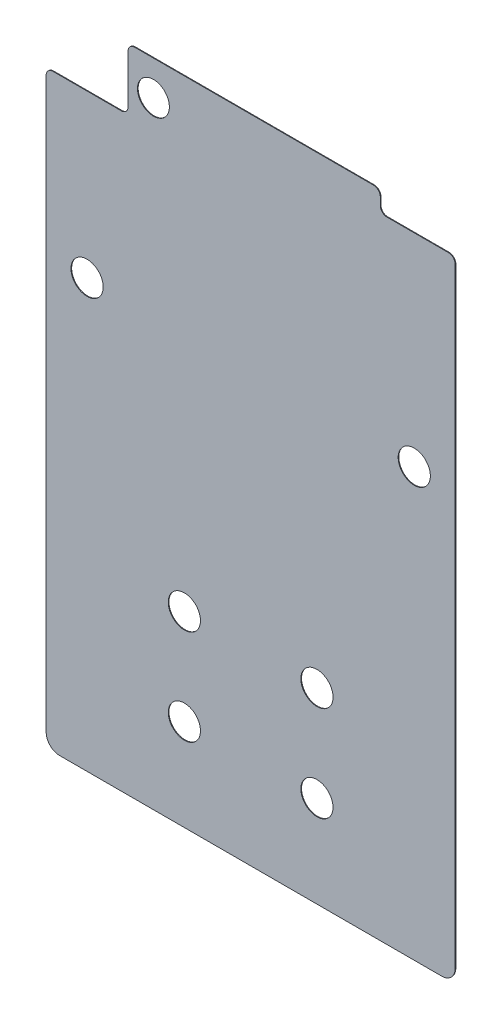
ISO-10303-21;
HEADER;
FILE_DESCRIPTION(('STEP AP214'),'2;1');
FILE_NAME('part.step','',(''),(''),'','','');
FILE_SCHEMA(('AUTOMOTIVE_DESIGN { 1 0 10303 214 1 1 1 1 }'));
ENDSEC;
DATA;
#1=APPLICATION_CONTEXT('core data for automotive mechanical design processes');
#2=APPLICATION_PROTOCOL_DEFINITION('international standard','automotive_design',2000,#1);
#3=PRODUCT_CONTEXT('',#1,'mechanical');
#4=PRODUCT('Part','Part','',(#3));
#5=PRODUCT_RELATED_PRODUCT_CATEGORY('part','',(#4));
#6=PRODUCT_DEFINITION_FORMATION('','',#4);
#7=PRODUCT_DEFINITION_CONTEXT('part definition',#1,'design');
#8=PRODUCT_DEFINITION('design','',#6,#7);
#9=PRODUCT_DEFINITION_SHAPE('','',#8);
#10=(LENGTH_UNIT() NAMED_UNIT(*) SI_UNIT(.MILLI.,.METRE.));
#11=(NAMED_UNIT(*) PLANE_ANGLE_UNIT() SI_UNIT($,.RADIAN.));
#12=(NAMED_UNIT(*) SI_UNIT($,.STERADIAN.) SOLID_ANGLE_UNIT());
#13=UNCERTAINTY_MEASURE_WITH_UNIT(LENGTH_MEASURE(1.E-05),#10,'distance_accuracy_value','');
#14=(GEOMETRIC_REPRESENTATION_CONTEXT(3) GLOBAL_UNCERTAINTY_ASSIGNED_CONTEXT((#13)) GLOBAL_UNIT_ASSIGNED_CONTEXT((#10,
#11,#12)) REPRESENTATION_CONTEXT('',''));
#15=CARTESIAN_POINT('',(0.,0.,0.));
#16=DIRECTION('',(0.,0.,1.));
#17=DIRECTION('',(1.,0.,0.));
#18=AXIS2_PLACEMENT_3D('',#15,#16,#17);
#19=CARTESIAN_POINT('',(-15.24,24.257,-0.05));
#20=DIRECTION('',(-1.,0.,0.));
#21=DIRECTION('',(0.,0.,1.));
#22=AXIS2_PLACEMENT_3D('',#19,#20,#21);
#23=PLANE('',#22);
#24=DIRECTION('',(0.,-1.,0.));
#25=VECTOR('',#24,1.);
#26=CARTESIAN_POINT('',(-15.24,24.257,0.));
#27=LINE('',#26,#25);
#28=CARTESIAN_POINT('',(-15.24,19.155745374,0.));
#29=VERTEX_POINT('',#28);
#30=CARTESIAN_POINT('',(-15.24,-23.257,0.));
#31=VERTEX_POINT('',#30);
#32=EDGE_CURVE('E137',#29,#31,#27,.T.);
#33=ORIENTED_EDGE('',*,*,#32,.F.);
#34=DIRECTION('',(0.,0.,1.));
#35=VECTOR('',#34,1.);
#36=CARTESIAN_POINT('',(-15.24,19.155745374,-0.05));
#37=LINE('',#36,#35);
#38=CARTESIAN_POINT('',(-15.24,19.155745374,-0.05));
#39=VERTEX_POINT('',#38);
#40=EDGE_CURVE('E195',#29,#39,#37,.F.);
#41=ORIENTED_EDGE('',*,*,#40,.T.);
#42=DIRECTION('',(0.,-1.,0.));
#43=VECTOR('',#42,1.);
#44=CARTESIAN_POINT('',(-15.24,24.257,-0.05));
#45=LINE('',#44,#43);
#46=CARTESIAN_POINT('',(-15.24,-23.257,-0.05));
#47=VERTEX_POINT('',#46);
#48=EDGE_CURVE('E158',#39,#47,#45,.T.);
#49=ORIENTED_EDGE('',*,*,#48,.T.);
#50=DIRECTION('',(0.,0.,1.));
#51=VECTOR('',#50,1.);
#52=CARTESIAN_POINT('',(-15.24,-23.257,-0.05));
#53=LINE('',#52,#51);
#54=EDGE_CURVE('E171',#47,#31,#53,.T.);
#55=ORIENTED_EDGE('',*,*,#54,.T.);
#56=EDGE_LOOP('',(#33,#41,#49,#55));
#57=FACE_BOUND('',#56,.T.);
#58=ADVANCED_FACE('F17',(#57),#23,.T.);
#59=CARTESIAN_POINT('',(15.24,24.257,-0.05));
#60=DIRECTION('',(0.,1.,0.));
#61=DIRECTION('',(-1.,0.,0.));
#62=AXIS2_PLACEMENT_3D('',#59,#60,#61);
#63=PLANE('',#62);
#64=DIRECTION('',(-1.,0.,0.));
#65=VECTOR('',#64,1.);
#66=CARTESIAN_POINT('',(15.24,24.257,0.));
#67=LINE('',#66,#65);
#68=CARTESIAN_POINT('',(9.16,24.257,0.));
#69=VERTEX_POINT('',#68);
#70=CARTESIAN_POINT('',(-8.63662,24.257,0.));
#71=VERTEX_POINT('',#70);
#72=EDGE_CURVE('E291',#69,#71,#67,.T.);
#73=ORIENTED_EDGE('',*,*,#72,.F.);
#74=DIRECTION('',(0.,0.,1.));
#75=VECTOR('',#74,1.);
#76=CARTESIAN_POINT('',(9.16,24.257,-0.05));
#77=LINE('',#76,#75);
#78=CARTESIAN_POINT('',(9.16,24.257,-0.05));
#79=VERTEX_POINT('',#78);
#80=EDGE_CURVE('E220',#69,#79,#77,.F.);
#81=ORIENTED_EDGE('',*,*,#80,.T.);
#82=DIRECTION('',(-1.,0.,0.));
#83=VECTOR('',#82,1.);
#84=CARTESIAN_POINT('',(15.24,24.257,-0.05));
#85=LINE('',#84,#83);
#86=CARTESIAN_POINT('',(-8.63662,24.257,-0.05));
#87=VERTEX_POINT('',#86);
#88=EDGE_CURVE('E161',#79,#87,#85,.T.);
#89=ORIENTED_EDGE('',*,*,#88,.T.);
#90=DIRECTION('',(0.,0.,1.));
#91=VECTOR('',#90,1.);
#92=CARTESIAN_POINT('',(-8.63662,24.257,-0.05));
#93=LINE('',#92,#91);
#94=EDGE_CURVE('E173',#87,#71,#93,.T.);
#95=ORIENTED_EDGE('',*,*,#94,.T.);
#96=EDGE_LOOP('',(#73,#81,#89,#95));
#97=FACE_BOUND('',#96,.T.);
#98=ADVANCED_FACE('F303',(#97),#63,.T.);
#99=CARTESIAN_POINT('',(-7.6962,-25.8572,-0.05));
#100=DIRECTION('',(0.,0.,1.));
#101=DIRECTION('',(1.,0.,0.));
#102=AXIS2_PLACEMENT_3D('',#99,#100,#101);
#103=PLANE('',#102);
#104=CARTESIAN_POINT('',(12.192,7.601,-0.05));
#105=DIRECTION('',(0.,0.,1.));
#106=DIRECTION('',(1.,0.,0.));
#107=AXIS2_PLACEMENT_3D('',#104,#105,#106);
#108=CIRCLE('',#107,1.2);
#109=CARTESIAN_POINT('',(13.392,7.601,-0.05));
#110=VERTEX_POINT('',#109);
#111=EDGE_CURVE('E256',#110,#110,#108,.F.);
#112=ORIENTED_EDGE('',*,*,#111,.F.);
#113=EDGE_LOOP('',(#112));
#114=FACE_BOUND('',#113,.T.);
#115=CARTESIAN_POINT('',(4.9403,-10.306,-0.05));
#116=DIRECTION('',(0.,0.,1.));
#117=DIRECTION('',(1.,0.,0.));
#118=AXIS2_PLACEMENT_3D('',#115,#116,#117);
#119=CIRCLE('',#118,1.2);
#120=CARTESIAN_POINT('',(6.1403,-10.306,-0.05));
#121=VERTEX_POINT('',#120);
#122=EDGE_CURVE('E266',#121,#121,#119,.F.);
#123=ORIENTED_EDGE('',*,*,#122,.F.);
#124=EDGE_LOOP('',(#123));
#125=FACE_BOUND('',#124,.T.);
#126=CARTESIAN_POINT('',(-4.9403,-10.306,-0.05));
#127=DIRECTION('',(0.,0.,1.));
#128=DIRECTION('',(1.,0.,0.));
#129=AXIS2_PLACEMENT_3D('',#126,#127,#128);
#130=CIRCLE('',#129,1.2);
#131=CARTESIAN_POINT('',(-3.7403,-10.306,-0.05));
#132=VERTEX_POINT('',#131);
#133=EDGE_CURVE('E272',#132,#132,#130,.F.);
#134=ORIENTED_EDGE('',*,*,#133,.F.);
#135=EDGE_LOOP('',(#134));
#136=FACE_BOUND('',#135,.T.);
#137=CARTESIAN_POINT('',(-4.9403,-17.418,-0.05));
#138=DIRECTION('',(0.,0.,1.));
#139=DIRECTION('',(1.,0.,0.));
#140=AXIS2_PLACEMENT_3D('',#137,#138,#139);
#141=CIRCLE('',#140,1.2);
#142=CARTESIAN_POINT('',(-3.7403,-17.418,-0.05));
#143=VERTEX_POINT('',#142);
#144=EDGE_CURVE('E278',#143,#143,#141,.F.);
#145=ORIENTED_EDGE('',*,*,#144,.F.);
#146=EDGE_LOOP('',(#145));
#147=FACE_BOUND('',#146,.T.);
#148=CARTESIAN_POINT('',(4.9403,-17.418,-0.05));
#149=DIRECTION('',(0.,0.,1.));
#150=DIRECTION('',(1.,0.,0.));
#151=AXIS2_PLACEMENT_3D('',#148,#149,#150);
#152=CIRCLE('',#151,1.2);
#153=CARTESIAN_POINT('',(6.1403,-17.418,-0.05));
#154=VERTEX_POINT('',#153);
#155=EDGE_CURVE('E245',#154,#154,#152,.F.);
#156=ORIENTED_EDGE('',*,*,#155,.F.);
#157=EDGE_LOOP('',(#156));
#158=FACE_BOUND('',#157,.T.);
#159=CARTESIAN_POINT('',(-12.192,7.601,-0.05));
#160=DIRECTION('',(0.,0.,1.));
#161=DIRECTION('',(1.,0.,0.));
#162=AXIS2_PLACEMENT_3D('',#159,#160,#161);
#163=CIRCLE('',#162,1.2);
#164=CARTESIAN_POINT('',(-10.992,7.601,-0.05));
#165=VERTEX_POINT('',#164);
#166=EDGE_CURVE('E255',#165,#165,#163,.F.);
#167=ORIENTED_EDGE('',*,*,#166,.F.);
#168=EDGE_LOOP('',(#167));
#169=FACE_BOUND('',#168,.T.);
#170=CARTESIAN_POINT('',(-7.24662,21.693243634,-0.05));
#171=DIRECTION('',(0.,0.,1.));
#172=DIRECTION('',(1.,0.,0.));
#173=AXIS2_PLACEMENT_3D('',#170,#171,#172);
#174=CIRCLE('',#173,1.18749826);
#175=CARTESIAN_POINT('',(-6.05912174,21.693243634,-0.05));
#176=VERTEX_POINT('',#175);
#177=EDGE_CURVE('E250',#176,#176,#174,.F.);
#178=ORIENTED_EDGE('',*,*,#177,.F.);
#179=EDGE_LOOP('',(#178));
#180=FACE_BOUND('',#179,.T.);
#181=DIRECTION('',(-1.,0.,0.));
#182=VECTOR('',#181,1.);
#183=CARTESIAN_POINT('',(15.24,22.695,-0.05));
#184=LINE('',#183,#182);
#185=CARTESIAN_POINT('',(14.74,22.695,-0.05));
#186=VERTEX_POINT('',#185);
#187=CARTESIAN_POINT('',(10.16,22.695,-0.05));
#188=VERTEX_POINT('',#187);
#189=EDGE_CURVE('E237',#186,#188,#184,.T.);
#190=ORIENTED_EDGE('',*,*,#189,.F.);
#191=CARTESIAN_POINT('',(14.74,22.195,-0.05));
#192=DIRECTION('',(0.,0.,1.));
#193=DIRECTION('',(1.,0.,0.));
#194=AXIS2_PLACEMENT_3D('',#191,#192,#193);
#195=CIRCLE('',#194,0.5);
#196=CARTESIAN_POINT('',(15.24,22.195,-0.05));
#197=VERTEX_POINT('',#196);
#198=EDGE_CURVE('E214',#186,#197,#195,.F.);
#199=ORIENTED_EDGE('',*,*,#198,.T.);
#200=DIRECTION('',(0.,1.,0.));
#201=VECTOR('',#200,1.);
#202=CARTESIAN_POINT('',(15.24,-24.257,-0.05));
#203=LINE('',#202,#201);
#204=CARTESIAN_POINT('',(15.24,-23.257,-0.05));
#205=VERTEX_POINT('',#204);
#206=EDGE_CURVE('E286',#205,#197,#203,.T.);
#207=ORIENTED_EDGE('',*,*,#206,.F.);
#208=CARTESIAN_POINT('',(14.24,-23.257,-0.05));
#209=DIRECTION('',(0.,0.,1.));
#210=DIRECTION('',(1.,0.,0.));
#211=AXIS2_PLACEMENT_3D('',#208,#209,#210);
#212=CIRCLE('',#211,1.);
#213=CARTESIAN_POINT('',(14.24,-24.257,-0.05));
#214=VERTEX_POINT('',#213);
#215=EDGE_CURVE('E169',#205,#214,#212,.F.);
#216=ORIENTED_EDGE('',*,*,#215,.T.);
#217=DIRECTION('',(1.,0.,0.));
#218=VECTOR('',#217,1.);
#219=CARTESIAN_POINT('',(7.6962,-24.257,-0.05));
#220=LINE('',#219,#218);
#221=CARTESIAN_POINT('',(-14.24,-24.257,-0.05));
#222=VERTEX_POINT('',#221);
#223=EDGE_CURVE('E152',#222,#214,#220,.T.);
#224=ORIENTED_EDGE('',*,*,#223,.F.);
#225=CARTESIAN_POINT('',(-14.24,-23.257,-0.05));
#226=DIRECTION('',(0.,0.,1.));
#227=DIRECTION('',(1.,0.,0.));
#228=AXIS2_PLACEMENT_3D('',#225,#226,#227);
#229=CIRCLE('',#228,1.);
#230=EDGE_CURVE('E157',#222,#47,#229,.F.);
#231=ORIENTED_EDGE('',*,*,#230,.T.);
#232=ORIENTED_EDGE('',*,*,#48,.F.);
#233=CARTESIAN_POINT('',(-14.74,19.155745374,-0.05));
#234=DIRECTION('',(0.,0.,1.));
#235=DIRECTION('',(1.,0.,0.));
#236=AXIS2_PLACEMENT_3D('',#233,#234,#235);
#237=CIRCLE('',#236,0.5);
#238=CARTESIAN_POINT('',(-14.74,19.655745374,-0.05));
#239=VERTEX_POINT('',#238);
#240=EDGE_CURVE('E185',#39,#239,#237,.F.);
#241=ORIENTED_EDGE('',*,*,#240,.T.);
#242=DIRECTION('',(1.,0.,0.));
#243=VECTOR('',#242,1.);
#244=CARTESIAN_POINT('',(0.,19.655745374,-0.05));
#245=LINE('',#244,#243);
#246=CARTESIAN_POINT('',(-9.63662,19.655745374,-0.05));
#247=VERTEX_POINT('',#246);
#248=EDGE_CURVE('E313',#239,#247,#245,.T.);
#249=ORIENTED_EDGE('',*,*,#248,.T.);
#250=CARTESIAN_POINT('',(-9.63662,20.155745374,-0.05));
#251=DIRECTION('',(0.,0.,1.));
#252=DIRECTION('',(1.,0.,0.));
#253=AXIS2_PLACEMENT_3D('',#250,#251,#252);
#254=CIRCLE('',#253,0.5);
#255=CARTESIAN_POINT('',(-9.13662,20.155745374,-0.05));
#256=VERTEX_POINT('',#255);
#257=EDGE_CURVE('E199',#247,#256,#254,.T.);
#258=ORIENTED_EDGE('',*,*,#257,.T.);
#259=DIRECTION('',(0.,1.,0.));
#260=VECTOR('',#259,1.);
#261=CARTESIAN_POINT('',(-9.13662,0.,-0.05));
#262=LINE('',#261,#260);
#263=CARTESIAN_POINT('',(-9.13662,23.757,-0.05));
#264=VERTEX_POINT('',#263);
#265=EDGE_CURVE('E306',#256,#264,#262,.T.);
#266=ORIENTED_EDGE('',*,*,#265,.T.);
#267=CARTESIAN_POINT('',(-8.63662,23.757,-0.05));
#268=DIRECTION('',(0.,0.,1.));
#269=DIRECTION('',(1.,0.,0.));
#270=AXIS2_PLACEMENT_3D('',#267,#268,#269);
#271=CIRCLE('',#270,0.5);
#272=EDGE_CURVE('E187',#264,#87,#271,.F.);
#273=ORIENTED_EDGE('',*,*,#272,.T.);
#274=ORIENTED_EDGE('',*,*,#88,.F.);
#275=CARTESIAN_POINT('',(9.16,23.757,-0.05));
#276=DIRECTION('',(0.,0.,1.));
#277=DIRECTION('',(1.,0.,0.));
#278=AXIS2_PLACEMENT_3D('',#275,#276,#277);
#279=CIRCLE('',#278,0.5);
#280=CARTESIAN_POINT('',(9.66,23.757,-0.05));
#281=VERTEX_POINT('',#280);
#282=EDGE_CURVE('E32',#79,#281,#279,.F.);
#283=ORIENTED_EDGE('',*,*,#282,.T.);
#284=DIRECTION('',(0.,1.,0.));
#285=VECTOR('',#284,1.);
#286=CARTESIAN_POINT('',(9.66,22.695,-0.05));
#287=LINE('',#286,#285);
#288=CARTESIAN_POINT('',(9.66,23.195,-0.05));
#289=VERTEX_POINT('',#288);
#290=EDGE_CURVE('E230',#289,#281,#287,.T.);
#291=ORIENTED_EDGE('',*,*,#290,.F.);
#292=CARTESIAN_POINT('',(10.16,23.195,-0.05));
#293=DIRECTION('',(0.,0.,1.));
#294=DIRECTION('',(1.,0.,0.));
#295=AXIS2_PLACEMENT_3D('',#292,#293,#294);
#296=CIRCLE('',#295,0.5);
#297=EDGE_CURVE('E11',#289,#188,#296,.T.);
#298=ORIENTED_EDGE('',*,*,#297,.T.);
#299=EDGE_LOOP('',(#190,#199,#207,#216,#224,#231,#232,#241,#249,#258,#266,#273,#274,#283,#291,#298));
#300=FACE_BOUND('',#299,.T.);
#301=ADVANCED_FACE('F236',(#114,#125,#136,#147,#158,#169,#180,#300),#103,.F.);
#302=CARTESIAN_POINT('',(-7.6962,-25.8572,0.));
#303=DIRECTION('',(0.,0.,1.));
#304=DIRECTION('',(1.,0.,0.));
#305=AXIS2_PLACEMENT_3D('',#302,#303,#304);
#306=PLANE('',#305);
#307=CARTESIAN_POINT('',(12.192,7.601,0.));
#308=DIRECTION('',(0.,0.,1.));
#309=DIRECTION('',(1.,0.,0.));
#310=AXIS2_PLACEMENT_3D('',#307,#308,#309);
#311=CIRCLE('',#310,1.2);
#312=CARTESIAN_POINT('',(13.392,7.601,0.));
#313=VERTEX_POINT('',#312);
#314=EDGE_CURVE('E263',#313,#313,#311,.T.);
#315=ORIENTED_EDGE('',*,*,#314,.F.);
#316=EDGE_LOOP('',(#315));
#317=FACE_BOUND('',#316,.T.);
#318=CARTESIAN_POINT('',(4.9403,-10.306,0.));
#319=DIRECTION('',(0.,0.,1.));
#320=DIRECTION('',(1.,0.,0.));
#321=AXIS2_PLACEMENT_3D('',#318,#319,#320);
#322=CIRCLE('',#321,1.2);
#323=CARTESIAN_POINT('',(6.1403,-10.306,0.));
#324=VERTEX_POINT('',#323);
#325=EDGE_CURVE('E269',#324,#324,#322,.T.);
#326=ORIENTED_EDGE('',*,*,#325,.F.);
#327=EDGE_LOOP('',(#326));
#328=FACE_BOUND('',#327,.T.);
#329=CARTESIAN_POINT('',(-4.9403,-10.306,0.));
#330=DIRECTION('',(0.,0.,1.));
#331=DIRECTION('',(1.,0.,0.));
#332=AXIS2_PLACEMENT_3D('',#329,#330,#331);
#333=CIRCLE('',#332,1.2);
#334=CARTESIAN_POINT('',(-3.7403,-10.306,0.));
#335=VERTEX_POINT('',#334);
#336=EDGE_CURVE('E275',#335,#335,#333,.T.);
#337=ORIENTED_EDGE('',*,*,#336,.F.);
#338=EDGE_LOOP('',(#337));
#339=FACE_BOUND('',#338,.T.);
#340=CARTESIAN_POINT('',(-4.9403,-17.418,0.));
#341=DIRECTION('',(0.,0.,1.));
#342=DIRECTION('',(1.,0.,0.));
#343=AXIS2_PLACEMENT_3D('',#340,#341,#342);
#344=CIRCLE('',#343,1.2);
#345=CARTESIAN_POINT('',(-3.7403,-17.418,0.));
#346=VERTEX_POINT('',#345);
#347=EDGE_CURVE('E262',#346,#346,#344,.T.);
#348=ORIENTED_EDGE('',*,*,#347,.F.);
#349=EDGE_LOOP('',(#348));
#350=FACE_BOUND('',#349,.T.);
#351=CARTESIAN_POINT('',(4.9403,-17.418,0.));
#352=DIRECTION('',(0.,0.,1.));
#353=DIRECTION('',(1.,0.,0.));
#354=AXIS2_PLACEMENT_3D('',#351,#352,#353);
#355=CIRCLE('',#354,1.2);
#356=CARTESIAN_POINT('',(6.1403,-17.418,0.));
#357=VERTEX_POINT('',#356);
#358=EDGE_CURVE('E242',#357,#357,#355,.T.);
#359=ORIENTED_EDGE('',*,*,#358,.F.);
#360=EDGE_LOOP('',(#359));
#361=FACE_BOUND('',#360,.T.);
#362=CARTESIAN_POINT('',(-12.192,7.601,0.));
#363=DIRECTION('',(0.,0.,1.));
#364=DIRECTION('',(1.,0.,0.));
#365=AXIS2_PLACEMENT_3D('',#362,#363,#364);
#366=CIRCLE('',#365,1.2);
#367=CARTESIAN_POINT('',(-10.992,7.601,0.));
#368=VERTEX_POINT('',#367);
#369=EDGE_CURVE('E252',#368,#368,#366,.T.);
#370=ORIENTED_EDGE('',*,*,#369,.F.);
#371=EDGE_LOOP('',(#370));
#372=FACE_BOUND('',#371,.T.);
#373=CARTESIAN_POINT('',(-7.24662,21.693243634,0.));
#374=DIRECTION('',(0.,0.,1.));
#375=DIRECTION('',(1.,0.,0.));
#376=AXIS2_PLACEMENT_3D('',#373,#374,#375);
#377=CIRCLE('',#376,1.18749826);
#378=CARTESIAN_POINT('',(-6.05912174,21.693243634,0.));
#379=VERTEX_POINT('',#378);
#380=EDGE_CURVE('E319',#379,#379,#377,.T.);
#381=ORIENTED_EDGE('',*,*,#380,.F.);
#382=EDGE_LOOP('',(#381));
#383=FACE_BOUND('',#382,.T.);
#384=DIRECTION('',(0.,1.,0.));
#385=VECTOR('',#384,1.);
#386=CARTESIAN_POINT('',(15.24,-24.257,0.));
#387=LINE('',#386,#385);
#388=CARTESIAN_POINT('',(15.24,-23.257,0.));
#389=VERTEX_POINT('',#388);
#390=CARTESIAN_POINT('',(15.24,22.195,0.));
#391=VERTEX_POINT('',#390);
#392=EDGE_CURVE('E258',#389,#391,#387,.T.);
#393=ORIENTED_EDGE('',*,*,#392,.T.);
#394=CARTESIAN_POINT('',(14.74,22.195,0.));
#395=DIRECTION('',(0.,0.,1.));
#396=DIRECTION('',(1.,0.,0.));
#397=AXIS2_PLACEMENT_3D('',#394,#395,#396);
#398=CIRCLE('',#397,0.5);
#399=CARTESIAN_POINT('',(14.74,22.695,0.));
#400=VERTEX_POINT('',#399);
#401=EDGE_CURVE('E206',#391,#400,#398,.T.);
#402=ORIENTED_EDGE('',*,*,#401,.T.);
#403=DIRECTION('',(1.,0.,0.));
#404=VECTOR('',#403,1.);
#405=CARTESIAN_POINT('',(15.24,22.695,0.));
#406=LINE('',#405,#404);
#407=CARTESIAN_POINT('',(10.16,22.695,0.));
#408=VERTEX_POINT('',#407);
#409=EDGE_CURVE('E225',#408,#400,#406,.T.);
#410=ORIENTED_EDGE('',*,*,#409,.F.);
#411=CARTESIAN_POINT('',(10.16,23.195,0.));
#412=DIRECTION('',(0.,0.,1.));
#413=DIRECTION('',(1.,0.,0.));
#414=AXIS2_PLACEMENT_3D('',#411,#412,#413);
#415=CIRCLE('',#414,0.5);
#416=CARTESIAN_POINT('',(9.66,23.195,0.));
#417=VERTEX_POINT('',#416);
#418=EDGE_CURVE('E25',#408,#417,#415,.F.);
#419=ORIENTED_EDGE('',*,*,#418,.T.);
#420=DIRECTION('',(0.,-1.,0.));
#421=VECTOR('',#420,1.);
#422=CARTESIAN_POINT('',(9.66,22.695,0.));
#423=LINE('',#422,#421);
#424=CARTESIAN_POINT('',(9.66,23.757,0.));
#425=VERTEX_POINT('',#424);
#426=EDGE_CURVE('E223',#425,#417,#423,.T.);
#427=ORIENTED_EDGE('',*,*,#426,.F.);
#428=CARTESIAN_POINT('',(9.16,23.757,0.));
#429=DIRECTION('',(0.,0.,1.));
#430=DIRECTION('',(1.,0.,0.));
#431=AXIS2_PLACEMENT_3D('',#428,#429,#430);
#432=CIRCLE('',#431,0.5);
#433=EDGE_CURVE('E204',#425,#69,#432,.T.);
#434=ORIENTED_EDGE('',*,*,#433,.T.);
#435=ORIENTED_EDGE('',*,*,#72,.T.);
#436=CARTESIAN_POINT('',(-8.63662,23.757,0.));
#437=DIRECTION('',(0.,0.,1.));
#438=DIRECTION('',(1.,0.,0.));
#439=AXIS2_PLACEMENT_3D('',#436,#437,#438);
#440=CIRCLE('',#439,0.5);
#441=CARTESIAN_POINT('',(-9.13662,23.757,0.));
#442=VERTEX_POINT('',#441);
#443=EDGE_CURVE('E178',#71,#442,#440,.T.);
#444=ORIENTED_EDGE('',*,*,#443,.T.);
#445=DIRECTION('',(0.,-1.,0.));
#446=VECTOR('',#445,1.);
#447=CARTESIAN_POINT('',(-9.13662,0.,0.));
#448=LINE('',#447,#446);
#449=CARTESIAN_POINT('',(-9.13662,20.155745374,0.));
#450=VERTEX_POINT('',#449);
#451=EDGE_CURVE('E311',#442,#450,#448,.T.);
#452=ORIENTED_EDGE('',*,*,#451,.T.);
#453=CARTESIAN_POINT('',(-9.63662,20.155745374,0.));
#454=DIRECTION('',(0.,0.,1.));
#455=DIRECTION('',(1.,0.,0.));
#456=AXIS2_PLACEMENT_3D('',#453,#454,#455);
#457=CIRCLE('',#456,0.5);
#458=CARTESIAN_POINT('',(-9.63662,19.655745374,0.));
#459=VERTEX_POINT('',#458);
#460=EDGE_CURVE('E197',#450,#459,#457,.F.);
#461=ORIENTED_EDGE('',*,*,#460,.T.);
#462=DIRECTION('',(-1.,0.,0.));
#463=VECTOR('',#462,1.);
#464=CARTESIAN_POINT('',(0.,19.655745374,0.));
#465=LINE('',#464,#463);
#466=CARTESIAN_POINT('',(-14.74,19.655745374,0.));
#467=VERTEX_POINT('',#466);
#468=EDGE_CURVE('E317',#459,#467,#465,.T.);
#469=ORIENTED_EDGE('',*,*,#468,.T.);
#470=CARTESIAN_POINT('',(-14.74,19.155745374,0.));
#471=DIRECTION('',(0.,0.,1.));
#472=DIRECTION('',(1.,0.,0.));
#473=AXIS2_PLACEMENT_3D('',#470,#471,#472);
#474=CIRCLE('',#473,0.5);
#475=EDGE_CURVE('E176',#467,#29,#474,.T.);
#476=ORIENTED_EDGE('',*,*,#475,.T.);
#477=ORIENTED_EDGE('',*,*,#32,.T.);
#478=CARTESIAN_POINT('',(-14.24,-23.257,0.));
#479=DIRECTION('',(0.,0.,1.));
#480=DIRECTION('',(1.,0.,0.));
#481=AXIS2_PLACEMENT_3D('',#478,#479,#480);
#482=CIRCLE('',#481,1.);
#483=CARTESIAN_POINT('',(-14.24,-24.257,0.));
#484=VERTEX_POINT('',#483);
#485=EDGE_CURVE('E131',#31,#484,#482,.T.);
#486=ORIENTED_EDGE('',*,*,#485,.T.);
#487=DIRECTION('',(1.,0.,0.));
#488=VECTOR('',#487,1.);
#489=CARTESIAN_POINT('',(-15.24,-24.257,0.));
#490=LINE('',#489,#488);
#491=CARTESIAN_POINT('',(14.24,-24.257,0.));
#492=VERTEX_POINT('',#491);
#493=EDGE_CURVE('E135',#484,#492,#490,.T.);
#494=ORIENTED_EDGE('',*,*,#493,.T.);
#495=CARTESIAN_POINT('',(14.24,-23.257,0.));
#496=DIRECTION('',(0.,0.,1.));
#497=DIRECTION('',(1.,0.,0.));
#498=AXIS2_PLACEMENT_3D('',#495,#496,#497);
#499=CIRCLE('',#498,1.);
#500=EDGE_CURVE('E142',#492,#389,#499,.T.);
#501=ORIENTED_EDGE('',*,*,#500,.T.);
#502=EDGE_LOOP('',(#393,#402,#410,#419,#427,#434,#435,#444,#452,#461,#469,#476,#477,#486,#494,#501));
#503=FACE_BOUND('',#502,.T.);
#504=ADVANCED_FACE('F134',(#317,#328,#339,#350,#361,#372,#383,#503),#306,.T.);
#505=CARTESIAN_POINT('',(-15.24,-24.257,-0.05));
#506=DIRECTION('',(0.,-1.,0.));
#507=DIRECTION('',(0.,0.,-1.));
#508=AXIS2_PLACEMENT_3D('',#505,#506,#507);
#509=PLANE('',#508);
#510=ORIENTED_EDGE('',*,*,#223,.T.);
#511=DIRECTION('',(0.,0.,1.));
#512=VECTOR('',#511,1.);
#513=CARTESIAN_POINT('',(14.24,-24.257,-0.05));
#514=LINE('',#513,#512);
#515=EDGE_CURVE('E143',#214,#492,#514,.T.);
#516=ORIENTED_EDGE('',*,*,#515,.T.);
#517=ORIENTED_EDGE('',*,*,#493,.F.);
#518=DIRECTION('',(0.,0.,1.));
#519=VECTOR('',#518,1.);
#520=CARTESIAN_POINT('',(-14.24,-24.257,-0.05));
#521=LINE('',#520,#519);
#522=EDGE_CURVE('E149',#484,#222,#521,.F.);
#523=ORIENTED_EDGE('',*,*,#522,.T.);
#524=EDGE_LOOP('',(#510,#516,#517,#523));
#525=FACE_BOUND('',#524,.T.);
#526=ADVANCED_FACE('F148',(#525),#509,.T.);
#527=CARTESIAN_POINT('',(15.24,-24.257,-0.05));
#528=DIRECTION('',(1.,0.,0.));
#529=DIRECTION('',(0.,0.,-1.));
#530=AXIS2_PLACEMENT_3D('',#527,#528,#529);
#531=PLANE('',#530);
#532=ORIENTED_EDGE('',*,*,#206,.T.);
#533=DIRECTION('',(0.,0.,1.));
#534=VECTOR('',#533,1.);
#535=CARTESIAN_POINT('',(15.24,22.195,0.));
#536=LINE('',#535,#534);
#537=EDGE_CURVE('E201',#197,#391,#536,.T.);
#538=ORIENTED_EDGE('',*,*,#537,.T.);
#539=ORIENTED_EDGE('',*,*,#392,.F.);
#540=DIRECTION('',(0.,0.,1.));
#541=VECTOR('',#540,1.);
#542=CARTESIAN_POINT('',(15.24,-23.257,-0.05));
#543=LINE('',#542,#541);
#544=EDGE_CURVE('E166',#389,#205,#543,.F.);
#545=ORIENTED_EDGE('',*,*,#544,.T.);
#546=EDGE_LOOP('',(#532,#538,#539,#545));
#547=FACE_BOUND('',#546,.T.);
#548=ADVANCED_FACE('F350',(#547),#531,.T.);
#549=CARTESIAN_POINT('',(12.192,7.601,-3.44411254969543));
#550=DIRECTION('',(0.,0.,1.));
#551=DIRECTION('',(1.,0.,0.));
#552=AXIS2_PLACEMENT_3D('',#549,#550,#551);
#553=CYLINDRICAL_SURFACE('',#552,1.2);
#554=ORIENTED_EDGE('',*,*,#111,.T.);
#555=EDGE_LOOP('',(#554));
#556=FACE_BOUND('',#555,.T.);
#557=ORIENTED_EDGE('',*,*,#314,.T.);
#558=EDGE_LOOP('',(#557));
#559=FACE_BOUND('',#558,.T.);
#560=ADVANCED_FACE('F353',(#556,#559),#553,.F.);
#561=CARTESIAN_POINT('',(4.9403,-10.306,-3.44411254969543));
#562=DIRECTION('',(0.,0.,1.));
#563=DIRECTION('',(1.,0.,0.));
#564=AXIS2_PLACEMENT_3D('',#561,#562,#563);
#565=CYLINDRICAL_SURFACE('',#564,1.2);
#566=ORIENTED_EDGE('',*,*,#122,.T.);
#567=EDGE_LOOP('',(#566));
#568=FACE_BOUND('',#567,.T.);
#569=ORIENTED_EDGE('',*,*,#325,.T.);
#570=EDGE_LOOP('',(#569));
#571=FACE_BOUND('',#570,.T.);
#572=ADVANCED_FACE('F509',(#568,#571),#565,.F.);
#573=CARTESIAN_POINT('',(-4.9403,-10.306,-3.44411254969543));
#574=DIRECTION('',(0.,0.,1.));
#575=DIRECTION('',(1.,0.,0.));
#576=AXIS2_PLACEMENT_3D('',#573,#574,#575);
#577=CYLINDRICAL_SURFACE('',#576,1.2);
#578=ORIENTED_EDGE('',*,*,#133,.T.);
#579=EDGE_LOOP('',(#578));
#580=FACE_BOUND('',#579,.T.);
#581=ORIENTED_EDGE('',*,*,#336,.T.);
#582=EDGE_LOOP('',(#581));
#583=FACE_BOUND('',#582,.T.);
#584=ADVANCED_FACE('F500',(#580,#583),#577,.F.);
#585=CARTESIAN_POINT('',(-4.9403,-17.418,-3.44411254969543));
#586=DIRECTION('',(0.,0.,1.));
#587=DIRECTION('',(1.,0.,0.));
#588=AXIS2_PLACEMENT_3D('',#585,#586,#587);
#589=CYLINDRICAL_SURFACE('',#588,1.2);
#590=ORIENTED_EDGE('',*,*,#144,.T.);
#591=EDGE_LOOP('',(#590));
#592=FACE_BOUND('',#591,.T.);
#593=ORIENTED_EDGE('',*,*,#347,.T.);
#594=EDGE_LOOP('',(#593));
#595=FACE_BOUND('',#594,.T.);
#596=ADVANCED_FACE('F490',(#592,#595),#589,.F.);
#597=CARTESIAN_POINT('',(4.9403,-17.418,-3.44411254969543));
#598=DIRECTION('',(0.,0.,1.));
#599=DIRECTION('',(1.,0.,0.));
#600=AXIS2_PLACEMENT_3D('',#597,#598,#599);
#601=CYLINDRICAL_SURFACE('',#600,1.2);
#602=ORIENTED_EDGE('',*,*,#155,.T.);
#603=EDGE_LOOP('',(#602));
#604=FACE_BOUND('',#603,.T.);
#605=ORIENTED_EDGE('',*,*,#358,.T.);
#606=EDGE_LOOP('',(#605));
#607=FACE_BOUND('',#606,.T.);
#608=ADVANCED_FACE('F480',(#604,#607),#601,.F.);
#609=CARTESIAN_POINT('',(-12.192,7.601,-3.44411254969543));
#610=DIRECTION('',(0.,0.,1.));
#611=DIRECTION('',(1.,0.,0.));
#612=AXIS2_PLACEMENT_3D('',#609,#610,#611);
#613=CYLINDRICAL_SURFACE('',#612,1.2);
#614=ORIENTED_EDGE('',*,*,#166,.T.);
#615=EDGE_LOOP('',(#614));
#616=FACE_BOUND('',#615,.T.);
#617=ORIENTED_EDGE('',*,*,#369,.T.);
#618=EDGE_LOOP('',(#617));
#619=FACE_BOUND('',#618,.T.);
#620=ADVANCED_FACE('F471',(#616,#619),#613,.F.);
#621=CARTESIAN_POINT('',(15.24,22.695,-5.84450118646981));
#622=DIRECTION('',(0.,-1.,0.));
#623=DIRECTION('',(0.,0.,-1.));
#624=AXIS2_PLACEMENT_3D('',#621,#622,#623);
#625=PLANE('',#624);
#626=ORIENTED_EDGE('',*,*,#409,.T.);
#627=DIRECTION('',(0.,0.,1.));
#628=VECTOR('',#627,1.);
#629=CARTESIAN_POINT('',(14.74,22.695,-0.05));
#630=LINE('',#629,#628);
#631=EDGE_CURVE('E211',#400,#186,#630,.F.);
#632=ORIENTED_EDGE('',*,*,#631,.T.);
#633=ORIENTED_EDGE('',*,*,#189,.T.);
#634=DIRECTION('',(0.,0.,1.));
#635=VECTOR('',#634,1.);
#636=CARTESIAN_POINT('',(10.16,22.695,0.));
#637=LINE('',#636,#635);
#638=EDGE_CURVE('E208',#188,#408,#637,.T.);
#639=ORIENTED_EDGE('',*,*,#638,.T.);
#640=EDGE_LOOP('',(#626,#632,#633,#639));
#641=FACE_BOUND('',#640,.T.);
#642=ADVANCED_FACE('F240',(#641),#625,.F.);
#643=CARTESIAN_POINT('',(9.66,22.695,-5.84450118646981));
#644=DIRECTION('',(-1.,0.,0.));
#645=DIRECTION('',(0.,0.,1.));
#646=AXIS2_PLACEMENT_3D('',#643,#644,#645);
#647=PLANE('',#646);
#648=ORIENTED_EDGE('',*,*,#426,.T.);
#649=DIRECTION('',(0.,0.,1.));
#650=VECTOR('',#649,1.);
#651=CARTESIAN_POINT('',(9.66,23.195,-0.05));
#652=LINE('',#651,#650);
#653=EDGE_CURVE('E39',#417,#289,#652,.F.);
#654=ORIENTED_EDGE('',*,*,#653,.T.);
#655=ORIENTED_EDGE('',*,*,#290,.T.);
#656=DIRECTION('',(0.,0.,1.));
#657=VECTOR('',#656,1.);
#658=CARTESIAN_POINT('',(9.66,23.757,0.));
#659=LINE('',#658,#657);
#660=EDGE_CURVE('E216',#281,#425,#659,.T.);
#661=ORIENTED_EDGE('',*,*,#660,.T.);
#662=EDGE_LOOP('',(#648,#654,#655,#661));
#663=FACE_BOUND('',#662,.T.);
#664=ADVANCED_FACE('F228',(#663),#647,.F.);
#665=CARTESIAN_POINT('',(14.24,-23.257,-0.05));
#666=DIRECTION('',(0.,0.,1.));
#667=DIRECTION('',(1.,0.,0.));
#668=AXIS2_PLACEMENT_3D('',#665,#666,#667);
#669=CYLINDRICAL_SURFACE('',#668,1.);
#670=ORIENTED_EDGE('',*,*,#215,.F.);
#671=ORIENTED_EDGE('',*,*,#544,.F.);
#672=ORIENTED_EDGE('',*,*,#500,.F.);
#673=ORIENTED_EDGE('',*,*,#515,.F.);
#674=EDGE_LOOP('',(#670,#671,#672,#673));
#675=FACE_BOUND('',#674,.T.);
#676=ADVANCED_FACE('F355',(#675),#669,.T.);
#677=CARTESIAN_POINT('',(-14.24,-23.257,-0.05));
#678=DIRECTION('',(0.,0.,1.));
#679=DIRECTION('',(1.,0.,0.));
#680=AXIS2_PLACEMENT_3D('',#677,#678,#679);
#681=CYLINDRICAL_SURFACE('',#680,1.);
#682=ORIENTED_EDGE('',*,*,#230,.F.);
#683=ORIENTED_EDGE('',*,*,#522,.F.);
#684=ORIENTED_EDGE('',*,*,#485,.F.);
#685=ORIENTED_EDGE('',*,*,#54,.F.);
#686=EDGE_LOOP('',(#682,#683,#684,#685));
#687=FACE_BOUND('',#686,.T.);
#688=ADVANCED_FACE('F155',(#687),#681,.T.);
#689=CARTESIAN_POINT('',(-7.24662,21.693243634,-3.4087522891729));
#690=DIRECTION('',(0.,0.,1.));
#691=DIRECTION('',(1.,0.,0.));
#692=AXIS2_PLACEMENT_3D('',#689,#690,#691);
#693=CYLINDRICAL_SURFACE('',#692,1.18749826);
#694=ORIENTED_EDGE('',*,*,#177,.T.);
#695=EDGE_LOOP('',(#694));
#696=FACE_BOUND('',#695,.T.);
#697=ORIENTED_EDGE('',*,*,#380,.T.);
#698=EDGE_LOOP('',(#697));
#699=FACE_BOUND('',#698,.T.);
#700=ADVANCED_FACE('F324',(#696,#699),#693,.F.);
#701=CARTESIAN_POINT('',(-9.13662,0.,-7.69348033016939));
#702=DIRECTION('',(-1.,0.,0.));
#703=DIRECTION('',(0.,-1.,0.));
#704=AXIS2_PLACEMENT_3D('',#701,#702,#703);
#705=PLANE('',#704);
#706=ORIENTED_EDGE('',*,*,#451,.F.);
#707=DIRECTION('',(0.,0.,1.));
#708=VECTOR('',#707,1.);
#709=CARTESIAN_POINT('',(-9.13662,23.757,-7.69348033016939));
#710=LINE('',#709,#708);
#711=EDGE_CURVE('E183',#442,#264,#710,.F.);
#712=ORIENTED_EDGE('',*,*,#711,.T.);
#713=ORIENTED_EDGE('',*,*,#265,.F.);
#714=DIRECTION('',(0.,0.,1.));
#715=VECTOR('',#714,1.);
#716=CARTESIAN_POINT('',(-9.13662,20.155745374,0.));
#717=LINE('',#716,#715);
#718=EDGE_CURVE('E180',#256,#450,#717,.T.);
#719=ORIENTED_EDGE('',*,*,#718,.T.);
#720=EDGE_LOOP('',(#706,#712,#713,#719));
#721=FACE_BOUND('',#720,.T.);
#722=ADVANCED_FACE('F425',(#721),#705,.T.);
#723=CARTESIAN_POINT('',(0.,19.655745374,-7.69348033016939));
#724=DIRECTION('',(0.,1.,0.));
#725=DIRECTION('',(0.,0.,1.));
#726=AXIS2_PLACEMENT_3D('',#723,#724,#725);
#727=PLANE('',#726);
#728=ORIENTED_EDGE('',*,*,#468,.F.);
#729=DIRECTION('',(0.,0.,1.));
#730=VECTOR('',#729,1.);
#731=CARTESIAN_POINT('',(-9.63662,19.655745374,-0.05));
#732=LINE('',#731,#730);
#733=EDGE_CURVE('E193',#459,#247,#732,.F.);
#734=ORIENTED_EDGE('',*,*,#733,.T.);
#735=ORIENTED_EDGE('',*,*,#248,.F.);
#736=DIRECTION('',(0.,0.,1.));
#737=VECTOR('',#736,1.);
#738=CARTESIAN_POINT('',(-14.74,19.655745374,-7.69348033016939));
#739=LINE('',#738,#737);
#740=EDGE_CURVE('E190',#239,#467,#739,.T.);
#741=ORIENTED_EDGE('',*,*,#740,.T.);
#742=EDGE_LOOP('',(#728,#734,#735,#741));
#743=FACE_BOUND('',#742,.T.);
#744=ADVANCED_FACE('F364',(#743),#727,.T.);
#745=CARTESIAN_POINT('',(-8.63662,23.757,-0.05));
#746=DIRECTION('',(0.,0.,1.));
#747=DIRECTION('',(1.,0.,0.));
#748=AXIS2_PLACEMENT_3D('',#745,#746,#747);
#749=CYLINDRICAL_SURFACE('',#748,0.5);
#750=ORIENTED_EDGE('',*,*,#272,.F.);
#751=ORIENTED_EDGE('',*,*,#711,.F.);
#752=ORIENTED_EDGE('',*,*,#443,.F.);
#753=ORIENTED_EDGE('',*,*,#94,.F.);
#754=EDGE_LOOP('',(#750,#751,#752,#753));
#755=FACE_BOUND('',#754,.T.);
#756=ADVANCED_FACE('F302',(#755),#749,.T.);
#757=CARTESIAN_POINT('',(-9.63662,20.155745374,-7.69348033016939));
#758=DIRECTION('',(0.,0.,-1.));
#759=DIRECTION('',(-1.,0.,0.));
#760=AXIS2_PLACEMENT_3D('',#757,#758,#759);
#761=CYLINDRICAL_SURFACE('',#760,0.5);
#762=ORIENTED_EDGE('',*,*,#257,.F.);
#763=ORIENTED_EDGE('',*,*,#733,.F.);
#764=ORIENTED_EDGE('',*,*,#460,.F.);
#765=ORIENTED_EDGE('',*,*,#718,.F.);
#766=EDGE_LOOP('',(#762,#763,#764,#765));
#767=FACE_BOUND('',#766,.T.);
#768=ADVANCED_FACE('F363',(#767),#761,.F.);
#769=CARTESIAN_POINT('',(-14.74,19.155745374,-7.69348033016939));
#770=DIRECTION('',(0.,0.,1.));
#771=DIRECTION('',(1.,0.,0.));
#772=AXIS2_PLACEMENT_3D('',#769,#770,#771);
#773=CYLINDRICAL_SURFACE('',#772,0.5);
#774=ORIENTED_EDGE('',*,*,#240,.F.);
#775=ORIENTED_EDGE('',*,*,#40,.F.);
#776=ORIENTED_EDGE('',*,*,#475,.F.);
#777=ORIENTED_EDGE('',*,*,#740,.F.);
#778=EDGE_LOOP('',(#774,#775,#776,#777));
#779=FACE_BOUND('',#778,.T.);
#780=ADVANCED_FACE('F367',(#779),#773,.T.);
#781=CARTESIAN_POINT('',(14.74,22.195,-0.05));
#782=DIRECTION('',(0.,0.,-1.));
#783=DIRECTION('',(-1.,0.,0.));
#784=AXIS2_PLACEMENT_3D('',#781,#782,#783);
#785=CYLINDRICAL_SURFACE('',#784,0.5);
#786=ORIENTED_EDGE('',*,*,#198,.F.);
#787=ORIENTED_EDGE('',*,*,#631,.F.);
#788=ORIENTED_EDGE('',*,*,#401,.F.);
#789=ORIENTED_EDGE('',*,*,#537,.F.);
#790=EDGE_LOOP('',(#786,#787,#788,#789));
#791=FACE_BOUND('',#790,.T.);
#792=ADVANCED_FACE('F371',(#791),#785,.T.);
#793=CARTESIAN_POINT('',(10.16,23.195,-5.84450118646981));
#794=DIRECTION('',(0.,0.,-1.));
#795=DIRECTION('',(-1.,0.,0.));
#796=AXIS2_PLACEMENT_3D('',#793,#794,#795);
#797=CYLINDRICAL_SURFACE('',#796,0.5);
#798=ORIENTED_EDGE('',*,*,#297,.F.);
#799=ORIENTED_EDGE('',*,*,#653,.F.);
#800=ORIENTED_EDGE('',*,*,#418,.F.);
#801=ORIENTED_EDGE('',*,*,#638,.F.);
#802=EDGE_LOOP('',(#798,#799,#800,#801));
#803=FACE_BOUND('',#802,.T.);
#804=ADVANCED_FACE('F233',(#803),#797,.F.);
#805=CARTESIAN_POINT('',(9.16,23.757,-5.84450118646981));
#806=DIRECTION('',(0.,0.,-1.));
#807=DIRECTION('',(-1.,0.,0.));
#808=AXIS2_PLACEMENT_3D('',#805,#806,#807);
#809=CYLINDRICAL_SURFACE('',#808,0.5);
#810=ORIENTED_EDGE('',*,*,#282,.F.);
#811=ORIENTED_EDGE('',*,*,#80,.F.);
#812=ORIENTED_EDGE('',*,*,#433,.F.);
#813=ORIENTED_EDGE('',*,*,#660,.F.);
#814=EDGE_LOOP('',(#810,#811,#812,#813));
#815=FACE_BOUND('',#814,.T.);
#816=ADVANCED_FACE('F19',(#815),#809,.T.);
#817=CLOSED_SHELL('',(#58,#98,#301,#504,#526,#548,#560,#572,#584,#596,#608,#620,#642,#664,#676,
#688,#700,#722,#744,#756,#768,#780,#792,#804,#816));
#818=MANIFOLD_SOLID_BREP('B1',#817);
#819=ADVANCED_BREP_SHAPE_REPRESENTATION('',(#18,#818),#14);
#820=SHAPE_DEFINITION_REPRESENTATION(#9,#819);
ENDSEC;
END-ISO-10303-21;
